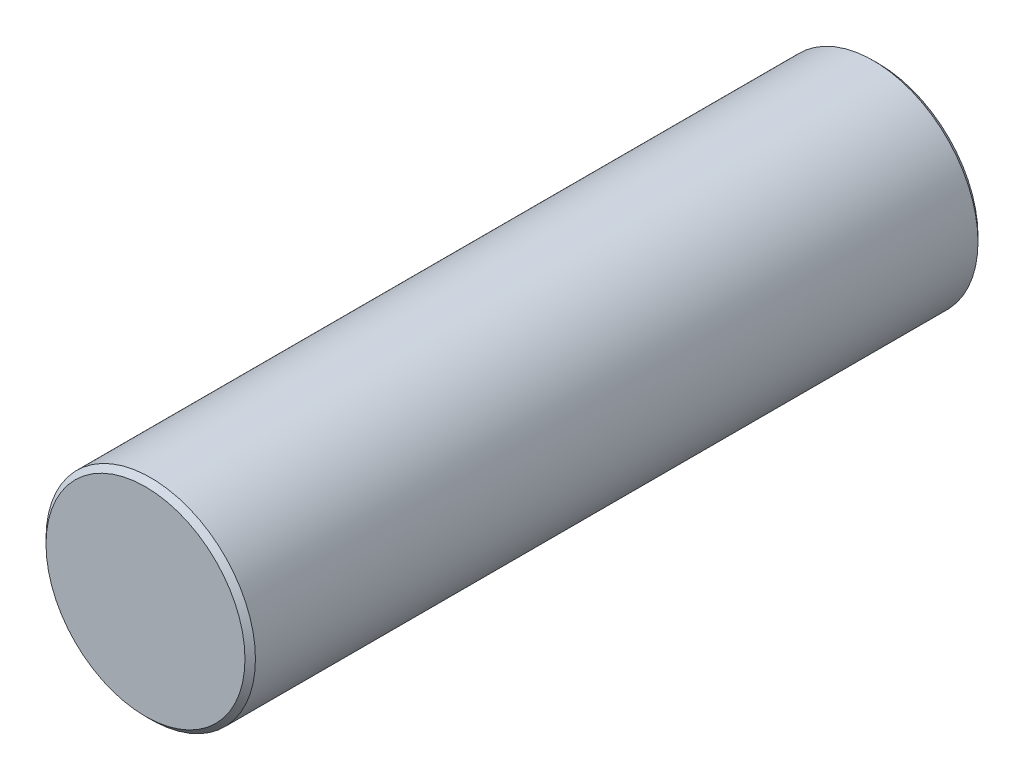
ISO-10303-21;
HEADER;
FILE_DESCRIPTION(('STEP AP214'),'2;1');
FILE_NAME('part.step','',(''),(''),'','','');
FILE_SCHEMA(('AUTOMOTIVE_DESIGN { 1 0 10303 214 1 1 1 1 }'));
ENDSEC;
DATA;
#1=APPLICATION_CONTEXT('core data for automotive mechanical design processes');
#2=APPLICATION_PROTOCOL_DEFINITION('international standard','automotive_design',2000,#1);
#3=PRODUCT_CONTEXT('',#1,'mechanical');
#4=PRODUCT('Part','Part','',(#3));
#5=PRODUCT_RELATED_PRODUCT_CATEGORY('part','',(#4));
#6=PRODUCT_DEFINITION_FORMATION('','',#4);
#7=PRODUCT_DEFINITION_CONTEXT('part definition',#1,'design');
#8=PRODUCT_DEFINITION('design','',#6,#7);
#9=PRODUCT_DEFINITION_SHAPE('','',#8);
#10=(LENGTH_UNIT() NAMED_UNIT(*) SI_UNIT(.MILLI.,.METRE.));
#11=(NAMED_UNIT(*) PLANE_ANGLE_UNIT() SI_UNIT($,.RADIAN.));
#12=(NAMED_UNIT(*) SI_UNIT($,.STERADIAN.) SOLID_ANGLE_UNIT());
#13=UNCERTAINTY_MEASURE_WITH_UNIT(LENGTH_MEASURE(1.E-05),#10,'distance_accuracy_value','');
#14=(GEOMETRIC_REPRESENTATION_CONTEXT(3) GLOBAL_UNCERTAINTY_ASSIGNED_CONTEXT((#13)) GLOBAL_UNIT_ASSIGNED_CONTEXT((#10,
#11,#12)) REPRESENTATION_CONTEXT('',''));
#15=CARTESIAN_POINT('',(0.,0.,0.));
#16=DIRECTION('',(0.,0.,1.));
#17=DIRECTION('',(1.,0.,0.));
#18=AXIS2_PLACEMENT_3D('',#15,#16,#17);
#19=CARTESIAN_POINT('',(0.,0.,-14.));
#20=DIRECTION('',(0.,0.,1.));
#21=DIRECTION('',(1.,0.,0.));
#22=AXIS2_PLACEMENT_3D('',#19,#20,#21);
#23=CYLINDRICAL_SURFACE('',#22,2.);
#24=CARTESIAN_POINT('',(0.,0.,-0.1));
#25=DIRECTION('',(0.,0.,1.));
#26=DIRECTION('',(1.,0.,0.));
#27=AXIS2_PLACEMENT_3D('',#24,#25,#26);
#28=CIRCLE('',#27,2.);
#29=CARTESIAN_POINT('',(2.,0.,-0.1));
#30=VERTEX_POINT('',#29);
#31=EDGE_CURVE('E36',#30,#30,#28,.F.);
#32=ORIENTED_EDGE('',*,*,#31,.T.);
#33=EDGE_LOOP('',(#32));
#34=FACE_BOUND('',#33,.T.);
#35=CARTESIAN_POINT('',(0.,0.,-13.9));
#36=DIRECTION('',(0.,0.,1.));
#37=DIRECTION('',(1.,0.,0.));
#38=AXIS2_PLACEMENT_3D('',#35,#36,#37);
#39=CIRCLE('',#38,2.);
#40=CARTESIAN_POINT('',(2.,0.,-13.9));
#41=VERTEX_POINT('',#40);
#42=EDGE_CURVE('E40',#41,#41,#39,.T.);
#43=ORIENTED_EDGE('',*,*,#42,.T.);
#44=EDGE_LOOP('',(#43));
#45=FACE_BOUND('',#44,.T.);
#46=ADVANCED_FACE('F30',(#34,#45),#23,.T.);
#47=CARTESIAN_POINT('',(0.,0.,-14.));
#48=DIRECTION('',(0.,0.,1.));
#49=DIRECTION('',(1.,0.,0.));
#50=AXIS2_PLACEMENT_3D('',#47,#48,#49);
#51=PLANE('',#50);
#52=CARTESIAN_POINT('',(0.,0.,-14.));
#53=DIRECTION('',(0.,0.,1.));
#54=DIRECTION('',(1.,0.,0.));
#55=AXIS2_PLACEMENT_3D('',#52,#53,#54);
#56=CIRCLE('',#55,1.9);
#57=CARTESIAN_POINT('',(1.9,0.,-14.));
#58=VERTEX_POINT('',#57);
#59=EDGE_CURVE('E10',#58,#58,#56,.F.);
#60=ORIENTED_EDGE('',*,*,#59,.T.);
#61=EDGE_LOOP('',(#60));
#62=FACE_BOUND('',#61,.T.);
#63=ADVANCED_FACE('F63',(#62),#51,.F.);
#64=CARTESIAN_POINT('',(0.,0.,0.));
#65=DIRECTION('',(0.,0.,1.));
#66=DIRECTION('',(1.,0.,0.));
#67=AXIS2_PLACEMENT_3D('',#64,#65,#66);
#68=PLANE('',#67);
#69=CARTESIAN_POINT('',(0.,0.,0.));
#70=DIRECTION('',(0.,0.,1.));
#71=DIRECTION('',(1.,0.,0.));
#72=AXIS2_PLACEMENT_3D('',#69,#70,#71);
#73=CIRCLE('',#72,1.9);
#74=CARTESIAN_POINT('',(1.9,0.,0.));
#75=VERTEX_POINT('',#74);
#76=EDGE_CURVE('E44',#75,#75,#73,.T.);
#77=ORIENTED_EDGE('',*,*,#76,.T.);
#78=EDGE_LOOP('',(#77));
#79=FACE_BOUND('',#78,.T.);
#80=ADVANCED_FACE('F50',(#79),#68,.T.);
#81=CARTESIAN_POINT('',(0.,0.,0.));
#82=DIRECTION('',(0.,0.,-1.));
#83=DIRECTION('',(-1.,0.,0.));
#84=AXIS2_PLACEMENT_3D('',#81,#82,#83);
#85=CONICAL_SURFACE('',#84,1.9,0.785398163397445);
#86=ORIENTED_EDGE('',*,*,#31,.F.);
#87=EDGE_LOOP('',(#86));
#88=FACE_BOUND('',#87,.T.);
#89=ORIENTED_EDGE('',*,*,#76,.F.);
#90=EDGE_LOOP('',(#89));
#91=FACE_BOUND('',#90,.T.);
#92=ADVANCED_FACE('F52',(#88,#91),#85,.T.);
#93=CARTESIAN_POINT('',(0.,0.,-13.9));
#94=DIRECTION('',(0.,0.,1.));
#95=DIRECTION('',(1.,0.,0.));
#96=AXIS2_PLACEMENT_3D('',#93,#94,#95);
#97=CONICAL_SURFACE('',#96,2.,0.785398163397451);
#98=ORIENTED_EDGE('',*,*,#59,.F.);
#99=EDGE_LOOP('',(#98));
#100=FACE_BOUND('',#99,.T.);
#101=ORIENTED_EDGE('',*,*,#42,.F.);
#102=EDGE_LOOP('',(#101));
#103=FACE_BOUND('',#102,.T.);
#104=ADVANCED_FACE('F54',(#100,#103),#97,.T.);
#105=CLOSED_SHELL('',(#46,#63,#80,#92,#104));
#106=MANIFOLD_SOLID_BREP('B2',#105);
#107=ADVANCED_BREP_SHAPE_REPRESENTATION('',(#18,#106),#14);
#108=SHAPE_DEFINITION_REPRESENTATION(#9,#107);
ENDSEC;
END-ISO-10303-21;
